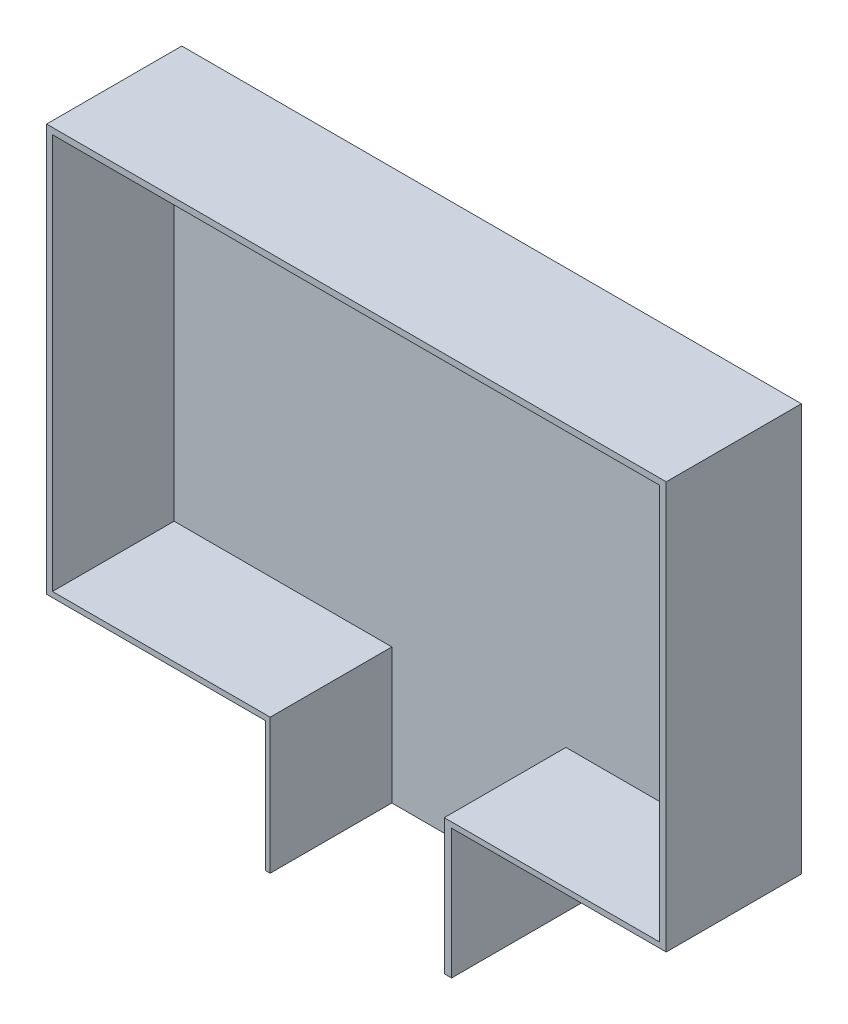
ISO-10303-21;
HEADER;
FILE_DESCRIPTION(('STEP AP214'),'2;1');
FILE_NAME('part.step','',(''),(''),'','','');
FILE_SCHEMA(('AUTOMOTIVE_DESIGN { 1 0 10303 214 1 1 1 1 }'));
ENDSEC;
DATA;
#1=APPLICATION_CONTEXT('core data for automotive mechanical design processes');
#2=APPLICATION_PROTOCOL_DEFINITION('international standard','automotive_design',2000,#1);
#3=PRODUCT_CONTEXT('',#1,'mechanical');
#4=PRODUCT('Part','Part','',(#3));
#5=PRODUCT_RELATED_PRODUCT_CATEGORY('part','',(#4));
#6=PRODUCT_DEFINITION_FORMATION('','',#4);
#7=PRODUCT_DEFINITION_CONTEXT('part definition',#1,'design');
#8=PRODUCT_DEFINITION('design','',#6,#7);
#9=PRODUCT_DEFINITION_SHAPE('','',#8);
#10=(LENGTH_UNIT() NAMED_UNIT(*) SI_UNIT(.MILLI.,.METRE.));
#11=(NAMED_UNIT(*) PLANE_ANGLE_UNIT() SI_UNIT($,.RADIAN.));
#12=(NAMED_UNIT(*) SI_UNIT($,.STERADIAN.) SOLID_ANGLE_UNIT());
#13=UNCERTAINTY_MEASURE_WITH_UNIT(LENGTH_MEASURE(1.E-05),#10,'distance_accuracy_value','');
#14=(GEOMETRIC_REPRESENTATION_CONTEXT(3) GLOBAL_UNCERTAINTY_ASSIGNED_CONTEXT((#13)) GLOBAL_UNIT_ASSIGNED_CONTEXT((#10,
#11,#12)) REPRESENTATION_CONTEXT('',''));
#15=CARTESIAN_POINT('',(0.,0.,0.));
#16=DIRECTION('',(0.,0.,1.));
#17=DIRECTION('',(1.,0.,0.));
#18=AXIS2_PLACEMENT_3D('',#15,#16,#17);
#19=CARTESIAN_POINT('',(0.,-18.1544226026763,10.));
#20=DIRECTION('',(0.,1.,0.));
#21=DIRECTION('',(0.,0.,1.));
#22=AXIS2_PLACEMENT_3D('',#19,#20,#21);
#23=PLANE('',#22);
#24=DIRECTION('',(0.,0.,1.));
#25=VECTOR('',#24,1.);
#26=CARTESIAN_POINT('',(170.562901485033,-18.1544226026763,1.));
#27=LINE('',#26,#25);
#28=CARTESIAN_POINT('',(170.562901485033,-18.1544226026763,1.));
#29=VERTEX_POINT('',#28);
#30=CARTESIAN_POINT('',(170.562901485033,-18.1544226026763,10.));
#31=VERTEX_POINT('',#30);
#32=EDGE_CURVE('E442',#29,#31,#27,.T.);
#33=ORIENTED_EDGE('',*,*,#32,.F.);
#34=DIRECTION('',(1.,0.,0.));
#35=VECTOR('',#34,1.);
#36=CARTESIAN_POINT('',(0.,-18.1544226026763,1.));
#37=LINE('',#36,#35);
#38=CARTESIAN_POINT('',(157.685927894997,-18.1544226026763,1.));
#39=VERTEX_POINT('',#38);
#40=EDGE_CURVE('E420',#39,#29,#37,.T.);
#41=ORIENTED_EDGE('',*,*,#40,.F.);
#42=DIRECTION('',(0.,0.,1.));
#43=VECTOR('',#42,1.);
#44=CARTESIAN_POINT('',(157.685927894997,-18.1544226026763,1.));
#45=LINE('',#44,#43);
#46=CARTESIAN_POINT('',(157.685927894997,-18.1544226026763,10.));
#47=VERTEX_POINT('',#46);
#48=EDGE_CURVE('E445',#39,#47,#45,.T.);
#49=ORIENTED_EDGE('',*,*,#48,.T.);
#50=DIRECTION('',(1.,0.,0.));
#51=VECTOR('',#50,1.);
#52=CARTESIAN_POINT('',(0.,-18.1544226026763,10.));
#53=LINE('',#52,#51);
#54=CARTESIAN_POINT('',(157.342044912947,-18.1544226026763,10.));
#55=VERTEX_POINT('',#54);
#56=EDGE_CURVE('E131',#55,#47,#53,.T.);
#57=ORIENTED_EDGE('',*,*,#56,.F.);
#58=DIRECTION('',(0.,0.,-1.));
#59=VECTOR('',#58,1.);
#60=CARTESIAN_POINT('',(157.342044912947,-18.1544226026763,10.));
#61=LINE('',#60,#59);
#62=CARTESIAN_POINT('',(157.342044912947,-18.1544226026763,0.));
#63=VERTEX_POINT('',#62);
#64=EDGE_CURVE('E140',#55,#63,#61,.T.);
#65=ORIENTED_EDGE('',*,*,#64,.T.);
#66=DIRECTION('',(1.,0.,0.));
#67=VECTOR('',#66,1.);
#68=CARTESIAN_POINT('',(0.,-18.1544226026763,0.));
#69=LINE('',#68,#67);
#70=CARTESIAN_POINT('',(171.105342621395,-18.1544226026763,0.));
#71=VERTEX_POINT('',#70);
#72=EDGE_CURVE('E137',#63,#71,#69,.T.);
#73=ORIENTED_EDGE('',*,*,#72,.T.);
#74=DIRECTION('',(0.,0.,-1.));
#75=VECTOR('',#74,1.);
#76=CARTESIAN_POINT('',(171.105342621395,-18.1544226026763,10.));
#77=LINE('',#76,#75);
#78=CARTESIAN_POINT('',(171.105342621395,-18.1544226026763,10.));
#79=VERTEX_POINT('',#78);
#80=EDGE_CURVE('E135',#79,#71,#77,.T.);
#81=ORIENTED_EDGE('',*,*,#80,.F.);
#82=EDGE_CURVE('E119',#31,#79,#53,.T.);
#83=ORIENTED_EDGE('',*,*,#82,.F.);
#84=EDGE_LOOP('',(#33,#41,#49,#57,#65,#73,#81,#83));
#85=FACE_BOUND('',#84,.T.);
#86=ADVANCED_FACE('F41',(#85),#23,.F.);
#87=CARTESIAN_POINT('',(0.,0.,10.));
#88=DIRECTION('',(0.,0.,1.));
#89=DIRECTION('',(1.,0.,0.));
#90=AXIS2_PLACEMENT_3D('',#87,#88,#89);
#91=PLANE('',#90);
#92=DIRECTION('',(1.,0.,0.));
#93=VECTOR('',#92,1.);
#94=CARTESIAN_POINT('',(0.,-8.15442260267631,10.));
#95=LINE('',#94,#93);
#96=CARTESIAN_POINT('',(170.562901485033,-8.15442260267631,10.));
#97=VERTEX_POINT('',#96);
#98=CARTESIAN_POINT('',(186.476959878026,-8.15442260267631,10.));
#99=VERTEX_POINT('',#98);
#100=EDGE_CURVE('E405',#97,#99,#95,.T.);
#101=ORIENTED_EDGE('',*,*,#100,.F.);
#102=DIRECTION('',(0.,-1.,0.));
#103=VECTOR('',#102,1.);
#104=CARTESIAN_POINT('',(170.562901485033,0.,10.));
#105=LINE('',#104,#103);
#106=EDGE_CURVE('E128',#97,#31,#105,.T.);
#107=ORIENTED_EDGE('',*,*,#106,.T.);
#108=ORIENTED_EDGE('',*,*,#82,.T.);
#109=DIRECTION('',(0.,1.,0.));
#110=VECTOR('',#109,1.);
#111=CARTESIAN_POINT('',(171.105342621395,0.,10.));
#112=LINE('',#111,#110);
#113=CARTESIAN_POINT('',(171.105342621395,-8.55442260267631,10.));
#114=VERTEX_POINT('',#113);
#115=EDGE_CURVE('E124',#79,#114,#112,.T.);
#116=ORIENTED_EDGE('',*,*,#115,.T.);
#117=DIRECTION('',(1.,0.,0.));
#118=VECTOR('',#117,1.);
#119=CARTESIAN_POINT('',(0.,-8.55442260267631,10.));
#120=LINE('',#119,#118);
#121=CARTESIAN_POINT('',(186.980947251584,-8.55442260267631,10.));
#122=VERTEX_POINT('',#121);
#123=EDGE_CURVE('E65',#114,#122,#120,.T.);
#124=ORIENTED_EDGE('',*,*,#123,.T.);
#125=DIRECTION('',(0.,-1.,0.));
#126=VECTOR('',#125,1.);
#127=CARTESIAN_POINT('',(186.980947251584,0.,10.));
#128=LINE('',#127,#126);
#129=CARTESIAN_POINT('',(186.980947251584,21.57070256315,10.));
#130=VERTEX_POINT('',#129);
#131=EDGE_CURVE('E194',#130,#122,#128,.T.);
#132=ORIENTED_EDGE('',*,*,#131,.F.);
#133=DIRECTION('',(1.,0.,0.));
#134=VECTOR('',#133,1.);
#135=CARTESIAN_POINT('',(0.,21.57070256315,10.));
#136=LINE('',#135,#134);
#137=CARTESIAN_POINT('',(141.147186926864,21.57070256315,10.));
#138=VERTEX_POINT('',#137);
#139=EDGE_CURVE('E191',#138,#130,#136,.T.);
#140=ORIENTED_EDGE('',*,*,#139,.F.);
#141=DIRECTION('',(0.,-1.,0.));
#142=VECTOR('',#141,1.);
#143=CARTESIAN_POINT('',(141.147186926864,0.,10.));
#144=LINE('',#143,#142);
#145=CARTESIAN_POINT('',(141.147186926864,-8.55442260267631,10.));
#146=VERTEX_POINT('',#145);
#147=EDGE_CURVE('E182',#138,#146,#144,.T.);
#148=ORIENTED_EDGE('',*,*,#147,.T.);
#149=CARTESIAN_POINT('',(157.342044912947,-8.55442260267631,10.));
#150=VERTEX_POINT('',#149);
#151=EDGE_CURVE('E147',#146,#150,#120,.T.);
#152=ORIENTED_EDGE('',*,*,#151,.T.);
#153=DIRECTION('',(0.,1.,0.));
#154=VECTOR('',#153,1.);
#155=CARTESIAN_POINT('',(157.342044912947,0.,10.));
#156=LINE('',#155,#154);
#157=EDGE_CURVE('E132',#55,#150,#156,.T.);
#158=ORIENTED_EDGE('',*,*,#157,.F.);
#159=ORIENTED_EDGE('',*,*,#56,.T.);
#160=DIRECTION('',(0.,-1.,0.));
#161=VECTOR('',#160,1.);
#162=CARTESIAN_POINT('',(157.685927894997,0.,10.));
#163=LINE('',#162,#161);
#164=CARTESIAN_POINT('',(157.685927894997,-8.15442260267631,10.));
#165=VERTEX_POINT('',#164);
#166=EDGE_CURVE('E434',#165,#47,#163,.T.);
#167=ORIENTED_EDGE('',*,*,#166,.F.);
#168=CARTESIAN_POINT('',(141.580211847495,-8.15442260267631,10.));
#169=VERTEX_POINT('',#168);
#170=EDGE_CURVE('E411',#169,#165,#95,.T.);
#171=ORIENTED_EDGE('',*,*,#170,.F.);
#172=DIRECTION('',(0.,-1.,0.));
#173=VECTOR('',#172,1.);
#174=CARTESIAN_POINT('',(141.580211847495,0.,10.));
#175=LINE('',#174,#173);
#176=CARTESIAN_POINT('',(141.580211847495,21.105773998046,10.));
#177=VERTEX_POINT('',#176);
#178=EDGE_CURVE('E430',#177,#169,#175,.T.);
#179=ORIENTED_EDGE('',*,*,#178,.F.);
#180=DIRECTION('',(1.,0.,0.));
#181=VECTOR('',#180,1.);
#182=CARTESIAN_POINT('',(0.,21.105773998046,10.));
#183=LINE('',#182,#181);
#184=CARTESIAN_POINT('',(186.476959878026,21.105773998046,10.));
#185=VERTEX_POINT('',#184);
#186=EDGE_CURVE('E427',#177,#185,#183,.T.);
#187=ORIENTED_EDGE('',*,*,#186,.T.);
#188=DIRECTION('',(0.,-1.,0.));
#189=VECTOR('',#188,1.);
#190=CARTESIAN_POINT('',(186.476959878026,0.,10.));
#191=LINE('',#190,#189);
#192=EDGE_CURVE('E56',#185,#99,#191,.T.);
#193=ORIENTED_EDGE('',*,*,#192,.T.);
#194=EDGE_LOOP('',(#101,#107,#108,#116,#124,#132,#140,#148,#152,#158,#159,#167,#171,#179,#187,#193));
#195=FACE_BOUND('',#194,.T.);
#196=ADVANCED_FACE('F122',(#195),#91,.T.);
#197=CARTESIAN_POINT('',(186.980947251584,0.,10.));
#198=DIRECTION('',(1.,0.,0.));
#199=DIRECTION('',(0.,0.,-1.));
#200=AXIS2_PLACEMENT_3D('',#197,#198,#199);
#201=PLANE('',#200);
#202=DIRECTION('',(0.,-1.,0.));
#203=VECTOR('',#202,1.);
#204=CARTESIAN_POINT('',(186.980947251584,0.,0.));
#205=LINE('',#204,#203);
#206=CARTESIAN_POINT('',(186.980947251584,21.57070256315,0.));
#207=VERTEX_POINT('',#206);
#208=CARTESIAN_POINT('',(186.980947251584,-8.55442260267631,0.));
#209=VERTEX_POINT('',#208);
#210=EDGE_CURVE('E151',#207,#209,#205,.T.);
#211=ORIENTED_EDGE('',*,*,#210,.F.);
#212=DIRECTION('',(0.,0.,-1.));
#213=VECTOR('',#212,1.);
#214=CARTESIAN_POINT('',(186.980947251584,21.57070256315,10.));
#215=LINE('',#214,#213);
#216=EDGE_CURVE('E11',#130,#207,#215,.T.);
#217=ORIENTED_EDGE('',*,*,#216,.F.);
#218=ORIENTED_EDGE('',*,*,#131,.T.);
#219=DIRECTION('',(0.,0.,-1.));
#220=VECTOR('',#219,1.);
#221=CARTESIAN_POINT('',(186.980947251584,-8.55442260267631,10.));
#222=LINE('',#221,#220);
#223=EDGE_CURVE('E97',#122,#209,#222,.T.);
#224=ORIENTED_EDGE('',*,*,#223,.T.);
#225=EDGE_LOOP('',(#211,#217,#218,#224));
#226=FACE_BOUND('',#225,.T.);
#227=ADVANCED_FACE('F43',(#226),#201,.T.);
#228=CARTESIAN_POINT('',(0.,21.57070256315,10.));
#229=DIRECTION('',(0.,1.,0.));
#230=DIRECTION('',(0.,0.,1.));
#231=AXIS2_PLACEMENT_3D('',#228,#229,#230);
#232=PLANE('',#231);
#233=DIRECTION('',(1.,0.,0.));
#234=VECTOR('',#233,1.);
#235=CARTESIAN_POINT('',(0.,21.57070256315,0.));
#236=LINE('',#235,#234);
#237=CARTESIAN_POINT('',(141.147186926864,21.57070256315,0.));
#238=VERTEX_POINT('',#237);
#239=EDGE_CURVE('E154',#238,#207,#236,.T.);
#240=ORIENTED_EDGE('',*,*,#239,.F.);
#241=DIRECTION('',(0.,0.,-1.));
#242=VECTOR('',#241,1.);
#243=CARTESIAN_POINT('',(141.147186926864,21.57070256315,10.));
#244=LINE('',#243,#242);
#245=EDGE_CURVE('E49',#138,#238,#244,.T.);
#246=ORIENTED_EDGE('',*,*,#245,.F.);
#247=ORIENTED_EDGE('',*,*,#139,.T.);
#248=ORIENTED_EDGE('',*,*,#216,.T.);
#249=EDGE_LOOP('',(#240,#246,#247,#248));
#250=FACE_BOUND('',#249,.T.);
#251=ADVANCED_FACE('F190',(#250),#232,.T.);
#252=CARTESIAN_POINT('',(141.147186926864,0.,10.));
#253=DIRECTION('',(1.,0.,0.));
#254=DIRECTION('',(0.,0.,-1.));
#255=AXIS2_PLACEMENT_3D('',#252,#253,#254);
#256=PLANE('',#255);
#257=DIRECTION('',(0.,-1.,0.));
#258=VECTOR('',#257,1.);
#259=CARTESIAN_POINT('',(141.147186926864,0.,0.));
#260=LINE('',#259,#258);
#261=CARTESIAN_POINT('',(141.147186926864,-8.55442260267631,0.));
#262=VERTEX_POINT('',#261);
#263=EDGE_CURVE('E158',#238,#262,#260,.T.);
#264=ORIENTED_EDGE('',*,*,#263,.T.);
#265=DIRECTION('',(0.,0.,-1.));
#266=VECTOR('',#265,1.);
#267=CARTESIAN_POINT('',(141.147186926864,-8.55442260267631,10.));
#268=LINE('',#267,#266);
#269=EDGE_CURVE('E175',#146,#262,#268,.T.);
#270=ORIENTED_EDGE('',*,*,#269,.F.);
#271=ORIENTED_EDGE('',*,*,#147,.F.);
#272=ORIENTED_EDGE('',*,*,#245,.T.);
#273=EDGE_LOOP('',(#264,#270,#271,#272));
#274=FACE_BOUND('',#273,.T.);
#275=ADVANCED_FACE('F180',(#274),#256,.F.);
#276=CARTESIAN_POINT('',(0.,-8.55442260267631,10.));
#277=DIRECTION('',(0.,1.,0.));
#278=DIRECTION('',(0.,0.,1.));
#279=AXIS2_PLACEMENT_3D('',#276,#277,#278);
#280=PLANE('',#279);
#281=DIRECTION('',(1.,0.,0.));
#282=VECTOR('',#281,1.);
#283=CARTESIAN_POINT('',(0.,-8.55442260267631,0.));
#284=LINE('',#283,#282);
#285=CARTESIAN_POINT('',(157.342044912947,-8.55442260267631,0.));
#286=VERTEX_POINT('',#285);
#287=EDGE_CURVE('E160',#262,#286,#284,.T.);
#288=ORIENTED_EDGE('',*,*,#287,.T.);
#289=DIRECTION('',(0.,0.,-1.));
#290=VECTOR('',#289,1.);
#291=CARTESIAN_POINT('',(157.342044912947,-8.55442260267631,10.));
#292=LINE('',#291,#290);
#293=EDGE_CURVE('E173',#150,#286,#292,.T.);
#294=ORIENTED_EDGE('',*,*,#293,.F.);
#295=ORIENTED_EDGE('',*,*,#151,.F.);
#296=ORIENTED_EDGE('',*,*,#269,.T.);
#297=EDGE_LOOP('',(#288,#294,#295,#296));
#298=FACE_BOUND('',#297,.T.);
#299=ADVANCED_FACE('F212',(#298),#280,.F.);
#300=CARTESIAN_POINT('',(157.342044912947,0.,10.));
#301=DIRECTION('',(-1.,0.,0.));
#302=DIRECTION('',(0.,0.,1.));
#303=AXIS2_PLACEMENT_3D('',#300,#301,#302);
#304=PLANE('',#303);
#305=DIRECTION('',(0.,1.,0.));
#306=VECTOR('',#305,1.);
#307=CARTESIAN_POINT('',(157.342044912947,0.,0.));
#308=LINE('',#307,#306);
#309=EDGE_CURVE('E163',#63,#286,#308,.T.);
#310=ORIENTED_EDGE('',*,*,#309,.F.);
#311=ORIENTED_EDGE('',*,*,#64,.F.);
#312=ORIENTED_EDGE('',*,*,#157,.T.);
#313=ORIENTED_EDGE('',*,*,#293,.T.);
#314=EDGE_LOOP('',(#310,#311,#312,#313));
#315=FACE_BOUND('',#314,.T.);
#316=ADVANCED_FACE('F205',(#315),#304,.T.);
#317=CARTESIAN_POINT('',(171.105342621395,0.,10.));
#318=DIRECTION('',(-1.,0.,0.));
#319=DIRECTION('',(0.,0.,1.));
#320=AXIS2_PLACEMENT_3D('',#317,#318,#319);
#321=PLANE('',#320);
#322=DIRECTION('',(0.,1.,0.));
#323=VECTOR('',#322,1.);
#324=CARTESIAN_POINT('',(171.105342621395,0.,0.));
#325=LINE('',#324,#323);
#326=CARTESIAN_POINT('',(171.105342621395,-8.55442260267631,0.));
#327=VERTEX_POINT('',#326);
#328=EDGE_CURVE('E168',#71,#327,#325,.T.);
#329=ORIENTED_EDGE('',*,*,#328,.T.);
#330=DIRECTION('',(0.,0.,-1.));
#331=VECTOR('',#330,1.);
#332=CARTESIAN_POINT('',(171.105342621395,-8.55442260267631,10.));
#333=LINE('',#332,#331);
#334=EDGE_CURVE('E141',#114,#327,#333,.T.);
#335=ORIENTED_EDGE('',*,*,#334,.F.);
#336=ORIENTED_EDGE('',*,*,#115,.F.);
#337=ORIENTED_EDGE('',*,*,#80,.T.);
#338=EDGE_LOOP('',(#329,#335,#336,#337));
#339=FACE_BOUND('',#338,.T.);
#340=ADVANCED_FACE('F143',(#339),#321,.F.);
#341=EDGE_CURVE('E164',#327,#209,#284,.T.);
#342=ORIENTED_EDGE('',*,*,#341,.T.);
#343=ORIENTED_EDGE('',*,*,#223,.F.);
#344=ORIENTED_EDGE('',*,*,#123,.F.);
#345=ORIENTED_EDGE('',*,*,#334,.T.);
#346=EDGE_LOOP('',(#342,#343,#344,#345));
#347=FACE_BOUND('',#346,.T.);
#348=ADVANCED_FACE('F215',(#347),#280,.F.);
#349=CARTESIAN_POINT('',(0.,0.,0.));
#350=DIRECTION('',(0.,0.,1.));
#351=DIRECTION('',(1.,0.,0.));
#352=AXIS2_PLACEMENT_3D('',#349,#350,#351);
#353=PLANE('',#352);
#354=ORIENTED_EDGE('',*,*,#210,.T.);
#355=ORIENTED_EDGE('',*,*,#341,.F.);
#356=ORIENTED_EDGE('',*,*,#328,.F.);
#357=ORIENTED_EDGE('',*,*,#72,.F.);
#358=ORIENTED_EDGE('',*,*,#309,.T.);
#359=ORIENTED_EDGE('',*,*,#287,.F.);
#360=ORIENTED_EDGE('',*,*,#263,.F.);
#361=ORIENTED_EDGE('',*,*,#239,.T.);
#362=EDGE_LOOP('',(#354,#355,#356,#357,#358,#359,#360,#361));
#363=FACE_BOUND('',#362,.T.);
#364=ADVANCED_FACE('F189',(#363),#353,.F.);
#365=CARTESIAN_POINT('',(186.476959878026,0.,1.));
#366=DIRECTION('',(-1.,0.,0.));
#367=DIRECTION('',(0.,0.,1.));
#368=AXIS2_PLACEMENT_3D('',#365,#366,#367);
#369=PLANE('',#368);
#370=ORIENTED_EDGE('',*,*,#192,.F.);
#371=DIRECTION('',(0.,0.,1.));
#372=VECTOR('',#371,1.);
#373=CARTESIAN_POINT('',(186.476959878026,21.105773998046,1.));
#374=LINE('',#373,#372);
#375=CARTESIAN_POINT('',(186.476959878026,21.105773998046,1.));
#376=VERTEX_POINT('',#375);
#377=EDGE_CURVE('E198',#376,#185,#374,.T.);
#378=ORIENTED_EDGE('',*,*,#377,.F.);
#379=DIRECTION('',(0.,-1.,0.));
#380=VECTOR('',#379,1.);
#381=CARTESIAN_POINT('',(186.476959878026,0.,1.));
#382=LINE('',#381,#380);
#383=CARTESIAN_POINT('',(186.476959878026,-8.15442260267631,1.));
#384=VERTEX_POINT('',#383);
#385=EDGE_CURVE('E394',#376,#384,#382,.T.);
#386=ORIENTED_EDGE('',*,*,#385,.T.);
#387=DIRECTION('',(0.,0.,1.));
#388=VECTOR('',#387,1.);
#389=CARTESIAN_POINT('',(186.476959878026,-8.15442260267631,1.));
#390=LINE('',#389,#388);
#391=EDGE_CURVE('E155',#384,#99,#390,.T.);
#392=ORIENTED_EDGE('',*,*,#391,.T.);
#393=EDGE_LOOP('',(#370,#378,#386,#392));
#394=FACE_BOUND('',#393,.T.);
#395=ADVANCED_FACE('F286',(#394),#369,.T.);
#396=CARTESIAN_POINT('',(0.,-8.15442260267631,1.));
#397=DIRECTION('',(0.,-1.,0.));
#398=DIRECTION('',(0.,0.,-1.));
#399=AXIS2_PLACEMENT_3D('',#396,#397,#398);
#400=PLANE('',#399);
#401=ORIENTED_EDGE('',*,*,#100,.T.);
#402=ORIENTED_EDGE('',*,*,#391,.F.);
#403=DIRECTION('',(1.,0.,0.));
#404=VECTOR('',#403,1.);
#405=CARTESIAN_POINT('',(0.,-8.15442260267631,1.));
#406=LINE('',#405,#404);
#407=CARTESIAN_POINT('',(170.562901485033,-8.15442260267631,1.));
#408=VERTEX_POINT('',#407);
#409=EDGE_CURVE('E402',#408,#384,#406,.T.);
#410=ORIENTED_EDGE('',*,*,#409,.F.);
#411=DIRECTION('',(0.,0.,1.));
#412=VECTOR('',#411,1.);
#413=CARTESIAN_POINT('',(170.562901485033,-8.15442260267631,1.));
#414=LINE('',#413,#412);
#415=EDGE_CURVE('E439',#408,#97,#414,.T.);
#416=ORIENTED_EDGE('',*,*,#415,.T.);
#417=EDGE_LOOP('',(#401,#402,#410,#416));
#418=FACE_BOUND('',#417,.T.);
#419=ADVANCED_FACE('F309',(#418),#400,.F.);
#420=CARTESIAN_POINT('',(170.562901485033,0.,1.));
#421=DIRECTION('',(-1.,0.,0.));
#422=DIRECTION('',(0.,0.,1.));
#423=AXIS2_PLACEMENT_3D('',#420,#421,#422);
#424=PLANE('',#423);
#425=ORIENTED_EDGE('',*,*,#106,.F.);
#426=ORIENTED_EDGE('',*,*,#415,.F.);
#427=DIRECTION('',(0.,-1.,0.));
#428=VECTOR('',#427,1.);
#429=CARTESIAN_POINT('',(170.562901485033,0.,1.));
#430=LINE('',#429,#428);
#431=EDGE_CURVE('E423',#408,#29,#430,.T.);
#432=ORIENTED_EDGE('',*,*,#431,.T.);
#433=ORIENTED_EDGE('',*,*,#32,.T.);
#434=EDGE_LOOP('',(#425,#426,#432,#433));
#435=FACE_BOUND('',#434,.T.);
#436=ADVANCED_FACE('F318',(#435),#424,.T.);
#437=CARTESIAN_POINT('',(157.685927894997,0.,1.));
#438=DIRECTION('',(-1.,0.,0.));
#439=DIRECTION('',(0.,0.,1.));
#440=AXIS2_PLACEMENT_3D('',#437,#438,#439);
#441=PLANE('',#440);
#442=ORIENTED_EDGE('',*,*,#166,.T.);
#443=ORIENTED_EDGE('',*,*,#48,.F.);
#444=DIRECTION('',(0.,-1.,0.));
#445=VECTOR('',#444,1.);
#446=CARTESIAN_POINT('',(157.685927894997,0.,1.));
#447=LINE('',#446,#445);
#448=CARTESIAN_POINT('',(157.685927894997,-8.15442260267631,1.));
#449=VERTEX_POINT('',#448);
#450=EDGE_CURVE('E417',#449,#39,#447,.T.);
#451=ORIENTED_EDGE('',*,*,#450,.F.);
#452=DIRECTION('',(0.,0.,1.));
#453=VECTOR('',#452,1.);
#454=CARTESIAN_POINT('',(157.685927894997,-8.15442260267631,1.));
#455=LINE('',#454,#453);
#456=EDGE_CURVE('E448',#449,#165,#455,.T.);
#457=ORIENTED_EDGE('',*,*,#456,.T.);
#458=EDGE_LOOP('',(#442,#443,#451,#457));
#459=FACE_BOUND('',#458,.T.);
#460=ADVANCED_FACE('F332',(#459),#441,.F.);
#461=ORIENTED_EDGE('',*,*,#170,.T.);
#462=ORIENTED_EDGE('',*,*,#456,.F.);
#463=CARTESIAN_POINT('',(141.580211847495,-8.15442260267631,1.));
#464=VERTEX_POINT('',#463);
#465=EDGE_CURVE('E414',#464,#449,#406,.T.);
#466=ORIENTED_EDGE('',*,*,#465,.F.);
#467=DIRECTION('',(0.,0.,1.));
#468=VECTOR('',#467,1.);
#469=CARTESIAN_POINT('',(141.580211847495,-8.15442260267631,1.));
#470=LINE('',#469,#468);
#471=EDGE_CURVE('E451',#464,#169,#470,.T.);
#472=ORIENTED_EDGE('',*,*,#471,.T.);
#473=EDGE_LOOP('',(#461,#462,#466,#472));
#474=FACE_BOUND('',#473,.T.);
#475=ADVANCED_FACE('F321',(#474),#400,.F.);
#476=CARTESIAN_POINT('',(141.580211847495,0.,1.));
#477=DIRECTION('',(-1.,0.,0.));
#478=DIRECTION('',(0.,0.,1.));
#479=AXIS2_PLACEMENT_3D('',#476,#477,#478);
#480=PLANE('',#479);
#481=ORIENTED_EDGE('',*,*,#178,.T.);
#482=ORIENTED_EDGE('',*,*,#471,.F.);
#483=DIRECTION('',(0.,-1.,0.));
#484=VECTOR('',#483,1.);
#485=CARTESIAN_POINT('',(141.580211847495,0.,1.));
#486=LINE('',#485,#484);
#487=CARTESIAN_POINT('',(141.580211847495,21.105773998046,1.));
#488=VERTEX_POINT('',#487);
#489=EDGE_CURVE('E407',#488,#464,#486,.T.);
#490=ORIENTED_EDGE('',*,*,#489,.F.);
#491=DIRECTION('',(0.,0.,1.));
#492=VECTOR('',#491,1.);
#493=CARTESIAN_POINT('',(141.580211847495,21.105773998046,1.));
#494=LINE('',#493,#492);
#495=EDGE_CURVE('E453',#488,#177,#494,.T.);
#496=ORIENTED_EDGE('',*,*,#495,.T.);
#497=EDGE_LOOP('',(#481,#482,#490,#496));
#498=FACE_BOUND('',#497,.T.);
#499=ADVANCED_FACE('F351',(#498),#480,.F.);
#500=CARTESIAN_POINT('',(0.,21.105773998046,1.));
#501=DIRECTION('',(0.,-1.,0.));
#502=DIRECTION('',(0.,0.,-1.));
#503=AXIS2_PLACEMENT_3D('',#500,#501,#502);
#504=PLANE('',#503);
#505=ORIENTED_EDGE('',*,*,#186,.F.);
#506=ORIENTED_EDGE('',*,*,#495,.F.);
#507=DIRECTION('',(1.,0.,0.));
#508=VECTOR('',#507,1.);
#509=CARTESIAN_POINT('',(0.,21.105773998046,1.));
#510=LINE('',#509,#508);
#511=EDGE_CURVE('E398',#488,#376,#510,.T.);
#512=ORIENTED_EDGE('',*,*,#511,.T.);
#513=ORIENTED_EDGE('',*,*,#377,.T.);
#514=EDGE_LOOP('',(#505,#506,#512,#513));
#515=FACE_BOUND('',#514,.T.);
#516=ADVANCED_FACE('F363',(#515),#504,.T.);
#517=CARTESIAN_POINT('',(0.,0.,1.));
#518=DIRECTION('',(0.,0.,1.));
#519=DIRECTION('',(1.,0.,0.));
#520=AXIS2_PLACEMENT_3D('',#517,#518,#519);
#521=PLANE('',#520);
#522=ORIENTED_EDGE('',*,*,#385,.F.);
#523=ORIENTED_EDGE('',*,*,#511,.F.);
#524=ORIENTED_EDGE('',*,*,#489,.T.);
#525=ORIENTED_EDGE('',*,*,#465,.T.);
#526=ORIENTED_EDGE('',*,*,#450,.T.);
#527=ORIENTED_EDGE('',*,*,#40,.T.);
#528=ORIENTED_EDGE('',*,*,#431,.F.);
#529=ORIENTED_EDGE('',*,*,#409,.T.);
#530=EDGE_LOOP('',(#522,#523,#524,#525,#526,#527,#528,#529));
#531=FACE_BOUND('',#530,.T.);
#532=ADVANCED_FACE('F373',(#531),#521,.T.);
#533=CLOSED_SHELL('',(#86,#196,#227,#251,#275,#299,#316,#340,#348,#364,#395,#419,#436,#460,#475,
#499,#516,#532));
#534=MANIFOLD_SOLID_BREP('B2',#533);
#535=ADVANCED_BREP_SHAPE_REPRESENTATION('',(#18,#534),#14);
#536=SHAPE_DEFINITION_REPRESENTATION(#9,#535);
ENDSEC;
END-ISO-10303-21;
